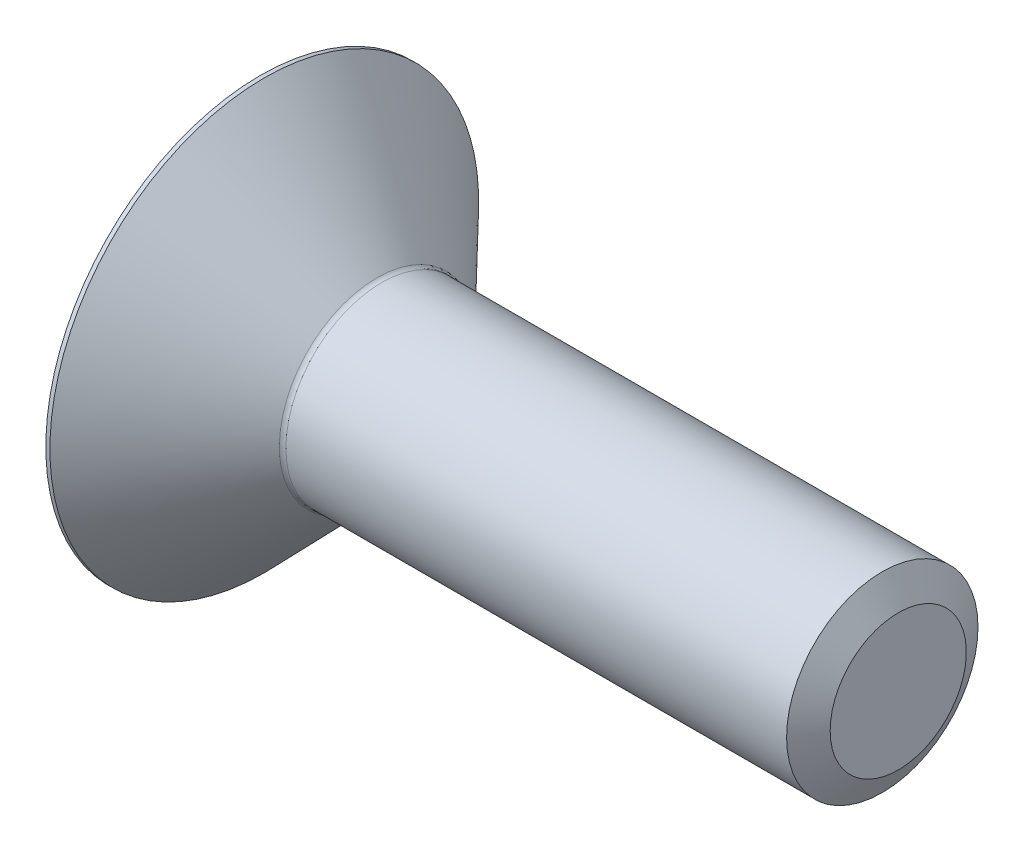
ISO-10303-21;
HEADER;
FILE_DESCRIPTION(('STEP AP214'),'2;1');
FILE_NAME('part.step','',(''),(''),'','','');
FILE_SCHEMA(('AUTOMOTIVE_DESIGN { 1 0 10303 214 1 1 1 1 }'));
ENDSEC;
DATA;
#1=APPLICATION_CONTEXT('core data for automotive mechanical design processes');
#2=APPLICATION_PROTOCOL_DEFINITION('international standard','automotive_design',2000,#1);
#3=PRODUCT_CONTEXT('',#1,'mechanical');
#4=PRODUCT('Part','Part','',(#3));
#5=PRODUCT_RELATED_PRODUCT_CATEGORY('part','',(#4));
#6=PRODUCT_DEFINITION_FORMATION('','',#4);
#7=PRODUCT_DEFINITION_CONTEXT('part definition',#1,'design');
#8=PRODUCT_DEFINITION('design','',#6,#7);
#9=PRODUCT_DEFINITION_SHAPE('','',#8);
#10=(LENGTH_UNIT() NAMED_UNIT(*) SI_UNIT(.MILLI.,.METRE.));
#11=(NAMED_UNIT(*) PLANE_ANGLE_UNIT() SI_UNIT($,.RADIAN.));
#12=(NAMED_UNIT(*) SI_UNIT($,.STERADIAN.) SOLID_ANGLE_UNIT());
#13=UNCERTAINTY_MEASURE_WITH_UNIT(LENGTH_MEASURE(1.E-05),#10,'distance_accuracy_value','');
#14=(GEOMETRIC_REPRESENTATION_CONTEXT(3) GLOBAL_UNCERTAINTY_ASSIGNED_CONTEXT((#13)) GLOBAL_UNIT_ASSIGNED_CONTEXT((#10,
#11,#12)) REPRESENTATION_CONTEXT('',''));
#15=CARTESIAN_POINT('',(0.,0.,0.));
#16=DIRECTION('',(0.,0.,1.));
#17=DIRECTION('',(1.,0.,0.));
#18=AXIS2_PLACEMENT_3D('',#15,#16,#17);
#19=CARTESIAN_POINT('',(0.,0.,0.));
#20=DIRECTION('',(1.,0.,0.));
#21=DIRECTION('',(0.,1.,0.));
#22=AXIS2_PLACEMENT_3D('',#19,#20,#21);
#23=CYLINDRICAL_SURFACE('',#22,1.5);
#24=CARTESIAN_POINT('',(-8.09755251837904,0.,0.));
#25=DIRECTION('',(1.,0.,0.));
#26=DIRECTION('',(0.,1.,0.));
#27=AXIS2_PLACEMENT_3D('',#24,#25,#26);
#28=CIRCLE('',#27,1.5);
#29=CARTESIAN_POINT('',(-8.09755251837904,1.5,0.));
#30=VERTEX_POINT('',#29);
#31=EDGE_CURVE('E133',#30,#30,#28,.T.);
#32=ORIENTED_EDGE('',*,*,#31,.T.);
#33=EDGE_LOOP('',(#32));
#34=FACE_BOUND('',#33,.T.);
#35=CARTESIAN_POINT('',(-0.25,0.,0.));
#36=DIRECTION('',(-1.,0.,0.));
#37=DIRECTION('',(0.,0.,1.));
#38=AXIS2_PLACEMENT_3D('',#35,#36,#37);
#39=CIRCLE('',#38,1.5);
#40=CARTESIAN_POINT('',(-0.25,0.,1.5));
#41=VERTEX_POINT('',#40);
#42=EDGE_CURVE('E321',#41,#41,#39,.T.);
#43=ORIENTED_EDGE('',*,*,#42,.T.);
#44=EDGE_LOOP('',(#43));
#45=FACE_BOUND('',#44,.T.);
#46=ADVANCED_FACE('F46',(#34,#45),#23,.T.);
#47=CARTESIAN_POINT('',(-10.,3.36,0.));
#48=DIRECTION('',(-1.,0.,0.));
#49=DIRECTION('',(0.,-1.,0.));
#50=AXIS2_PLACEMENT_3D('',#47,#48,#49);
#51=PLANE('',#50);
#52=CARTESIAN_POINT('',(-10.,0.,0.));
#53=DIRECTION('',(1.,0.,0.));
#54=DIRECTION('',(0.,1.,0.));
#55=AXIS2_PLACEMENT_3D('',#52,#53,#54);
#56=CIRCLE('',#55,3.36);
#57=CARTESIAN_POINT('',(-10.,3.36,0.));
#58=VERTEX_POINT('',#57);
#59=EDGE_CURVE('E224',#58,#58,#56,.T.);
#60=ORIENTED_EDGE('',*,*,#59,.F.);
#61=EDGE_LOOP('',(#60));
#62=FACE_BOUND('',#61,.T.);
#63=CARTESIAN_POINT('',(-10.,0.,0.));
#64=DIRECTION('',(-1.,0.,0.));
#65=DIRECTION('',(0.,-1.,0.));
#66=AXIS2_PLACEMENT_3D('',#63,#64,#65);
#67=CIRCLE('',#66,1.15470053837925);
#68=CARTESIAN_POINT('',(-10.,-0.57735026918963,0.999999999999998));
#69=VERTEX_POINT('',#68);
#70=CARTESIAN_POINT('',(-10.,-1.15470053837925,0.));
#71=VERTEX_POINT('',#70);
#72=EDGE_CURVE('E50',#69,#71,#67,.F.);
#73=ORIENTED_EDGE('',*,*,#72,.T.);
#74=CARTESIAN_POINT('',(-10.,-0.577350269189629,-0.999999999999999));
#75=VERTEX_POINT('',#74);
#76=EDGE_CURVE('E11',#71,#75,#67,.F.);
#77=ORIENTED_EDGE('',*,*,#76,.T.);
#78=CARTESIAN_POINT('',(-10.,0.577350269189627,-0.999999999999999));
#79=VERTEX_POINT('',#78);
#80=EDGE_CURVE('E55',#75,#79,#67,.F.);
#81=ORIENTED_EDGE('',*,*,#80,.T.);
#82=CARTESIAN_POINT('',(-10.,1.15470053837925,0.));
#83=VERTEX_POINT('',#82);
#84=EDGE_CURVE('E120',#79,#83,#67,.F.);
#85=ORIENTED_EDGE('',*,*,#84,.T.);
#86=CARTESIAN_POINT('',(-10.,0.,0.));
#87=DIRECTION('',(-1.,0.,0.));
#88=DIRECTION('',(0.,0.,1.));
#89=AXIS2_PLACEMENT_3D('',#86,#87,#88);
#90=CIRCLE('',#89,1.15470053837925);
#91=CARTESIAN_POINT('',(-10.,0.57735026918963,0.999999999999998));
#92=VERTEX_POINT('',#91);
#93=EDGE_CURVE('E105',#92,#83,#90,.T.);
#94=ORIENTED_EDGE('',*,*,#93,.F.);
#95=EDGE_CURVE('E114',#92,#69,#67,.F.);
#96=ORIENTED_EDGE('',*,*,#95,.T.);
#97=EDGE_LOOP('',(#73,#77,#81,#85,#94,#96));
#98=FACE_BOUND('',#97,.T.);
#99=ADVANCED_FACE('F121',(#62,#98),#51,.T.);
#100=CARTESIAN_POINT('',(0.,0.,0.));
#101=DIRECTION('',(1.,0.,0.));
#102=DIRECTION('',(0.,1.,0.));
#103=AXIS2_PLACEMENT_3D('',#100,#101,#102);
#104=CYLINDRICAL_SURFACE('',#103,3.36);
#105=ORIENTED_EDGE('',*,*,#59,.T.);
#106=EDGE_LOOP('',(#105));
#107=FACE_BOUND('',#106,.T.);
#108=CARTESIAN_POINT('',(-9.93618112114116,0.,0.));
#109=DIRECTION('',(1.,0.,0.));
#110=DIRECTION('',(0.,1.,0.));
#111=AXIS2_PLACEMENT_3D('',#108,#109,#110);
#112=CIRCLE('',#111,3.36);
#113=CARTESIAN_POINT('',(-9.93618112114116,3.36,0.));
#114=VERTEX_POINT('',#113);
#115=EDGE_CURVE('E226',#114,#114,#112,.T.);
#116=ORIENTED_EDGE('',*,*,#115,.F.);
#117=EDGE_LOOP('',(#116));
#118=FACE_BOUND('',#117,.T.);
#119=ADVANCED_FACE('F212',(#107,#118),#104,.T.);
#120=CARTESIAN_POINT('',(-8.1694864984129,0.,0.));
#121=DIRECTION('',(-1.,0.,0.));
#122=DIRECTION('',(0.,-1.,0.));
#123=AXIS2_PLACEMENT_3D('',#120,#121,#122);
#124=CONICAL_SURFACE('',#123,1.5305341629541,0.802851455917393);
#125=ORIENTED_EDGE('',*,*,#115,.T.);
#126=EDGE_LOOP('',(#125));
#127=FACE_BOUND('',#126,.T.);
#128=CARTESIAN_POINT('',(-8.1694864984129,0.,0.));
#129=DIRECTION('',(1.,0.,0.));
#130=DIRECTION('',(0.,1.,0.));
#131=AXIS2_PLACEMENT_3D('',#128,#129,#130);
#132=CIRCLE('',#131,1.5305341629541);
#133=CARTESIAN_POINT('',(-8.1694864984129,1.5305341629541,0.));
#134=VERTEX_POINT('',#133);
#135=EDGE_CURVE('E230',#134,#134,#132,.T.);
#136=ORIENTED_EDGE('',*,*,#135,.F.);
#137=EDGE_LOOP('',(#136));
#138=FACE_BOUND('',#137,.T.);
#139=ADVANCED_FACE('F208',(#127,#138),#124,.T.);
#140=CARTESIAN_POINT('',(-8.09755251837904,0.,0.));
#141=DIRECTION('',(1.,0.,0.));
#142=DIRECTION('',(0.,1.,0.));
#143=AXIS2_PLACEMENT_3D('',#140,#141,#142);
#144=TOROIDAL_SURFACE('',#143,1.6,0.0999999999999989);
#145=ORIENTED_EDGE('',*,*,#135,.T.);
#146=EDGE_LOOP('',(#145));
#147=FACE_BOUND('',#146,.T.);
#148=ORIENTED_EDGE('',*,*,#31,.F.);
#149=EDGE_LOOP('',(#148));
#150=FACE_BOUND('',#149,.T.);
#151=ADVANCED_FACE('F204',(#147,#150),#144,.F.);
#152=CARTESIAN_POINT('',(-9.7,0.,0.));
#153=DIRECTION('',(-1.,0.,0.));
#154=DIRECTION('',(0.,0.,1.));
#155=AXIS2_PLACEMENT_3D('',#152,#153,#154);
#156=CONICAL_SURFACE('',#155,0.,1.31660847419537);
#157=CARTESIAN_POINT('',(-10.0000300044996,-0.577234799135789,1.0002));
#158=CARTESIAN_POINT('',(-9.99379291920422,-0.6012250217386,0.958647715567044));
#159=CARTESIAN_POINT('',(-9.98813137861672,-0.625256195021441,0.917024502475671));
#160=CARTESIAN_POINT('',(-9.97818542172232,-0.67339838633044,0.833639781140784));
#161=CARTESIAN_POINT('',(-9.9739015302713,-0.697509431260084,0.791878226299064));
#162=CARTESIAN_POINT('',(-9.96695890316675,-0.745673772514856,0.708455140132714));
#163=CARTESIAN_POINT('',(-9.9642923745456,-0.769726780462718,0.666794108292159));
#164=CARTESIAN_POINT('',(-9.96071689299408,-0.81786166422335,0.583422044002323));
#165=CARTESIAN_POINT('',(-9.95980762113533,-0.841943534003895,0.541711022001162));
#166=CARTESIAN_POINT('',(-9.95980762113533,-0.890107273564984,0.458288977998839));
#167=CARTESIAN_POINT('',(-9.96071689299408,-0.914189143345529,0.416577955997677));
#168=CARTESIAN_POINT('',(-9.9642923745456,-0.962324027106161,0.333205891707841));
#169=CARTESIAN_POINT('',(-9.96695890316675,-0.986377035054023,0.291544859867286));
#170=CARTESIAN_POINT('',(-9.9739015302713,-1.03454137630879,0.208121773700936));
#171=CARTESIAN_POINT('',(-9.97818542172232,-1.05865242123844,0.166360218859216));
#172=CARTESIAN_POINT('',(-9.98813137861672,-1.10679461254744,0.0829754975243293));
#173=CARTESIAN_POINT('',(-9.99379291920422,-1.13082578583028,0.0413522844329566));
#174=CARTESIAN_POINT('',(-10.0000300044996,-1.15481600843309,-0.000199999999999398));
#175=B_SPLINE_CURVE_WITH_KNOTS('',3,(#157,#158,#159,#160,#161,#162,#163,#164,#165,#166,#167,
#168,#169,#170,#171,#172,#173,#174),.UNSPECIFIED.,.F.,.F.,(4,2,2,2,2,2,2,2,4),(0.,
0.145159524820137,0.290374287087485,0.434883682122849,0.57936684736763,0.723850012612411,
0.868359407647776,1.01357416991512,1.15873369473526),.UNSPECIFIED.);
#176=EDGE_CURVE('E139',#69,#71,#175,.T.);
#177=ORIENTED_EDGE('',*,*,#176,.T.);
#178=ORIENTED_EDGE('',*,*,#72,.F.);
#179=EDGE_LOOP('',(#177,#178));
#180=FACE_BOUND('',#179,.T.);
#181=ADVANCED_FACE('F207',(#180),#156,.F.);
#182=CARTESIAN_POINT('',(-10.1701338061757,-1.50813004503231,1.));
#183=CARTESIAN_POINT('',(-10.1603550434582,-1.46296169551439,1.));
#184=CARTESIAN_POINT('',(-10.1507010634319,-1.41776633015547,1.));
#185=CARTESIAN_POINT('',(-10.1317057249496,-1.32730802004726,1.));
#186=CARTESIAN_POINT('',(-10.1223643798043,-1.28204507250605,1.));
#187=CARTESIAN_POINT('',(-10.094887707109,-1.1460540932135,1.));
#188=CARTESIAN_POINT('',(-10.077318593487,-1.05520983554783,1.));
#189=CARTESIAN_POINT('',(-10.0446113120355,-0.873838301527072,1.));
#190=CARTESIAN_POINT('',(-10.0294545669183,-0.783314439111172,1.));
#191=CARTESIAN_POINT('',(-10.0026000869216,-0.60175454493786,1.));
#192=CARTESIAN_POINT('',(-9.99090169604684,-0.510718613654572,1.));
#193=CARTESIAN_POINT('',(-9.97246881045879,-0.32714728936339,1.));
#194=CARTESIAN_POINT('',(-9.96578776188203,-0.234606191530869,1.));
#195=CARTESIAN_POINT('',(-9.95903683627918,-0.0493046546038925,1.));
#196=CARTESIAN_POINT('',(-9.9589640024594,0.0434556678202325,1.));
#197=CARTESIAN_POINT('',(-9.96545349339635,0.229083736297407,1.));
#198=CARTESIAN_POINT('',(-9.97204147369278,0.32195051098941,1.));
#199=CARTESIAN_POINT('',(-9.99045721398657,0.50719254766132,1.));
#200=CARTESIAN_POINT('',(-10.0022884816115,0.599567438647765,1.));
#201=CARTESIAN_POINT('',(-10.0298118313046,0.785811374344474,1.));
#202=CARTESIAN_POINT('',(-10.0455836030667,0.879668210998825,1.));
#203=CARTESIAN_POINT('',(-10.0795232966728,1.06695285350417,1.));
#204=CARTESIAN_POINT('',(-10.0976915787193,1.16038059267178,1.));
#205=CARTESIAN_POINT('',(-10.1355853163011,1.34694314919725,1.));
#206=CARTESIAN_POINT('',(-10.1553112029702,1.44007787798179,1.));
#207=CARTESIAN_POINT('',(-10.1957971322914,1.62612272763755,1.));
#208=CARTESIAN_POINT('',(-10.216557196056,1.71903284388273,1.));
#209=CARTESIAN_POINT('',(-10.2585485742601,1.90363742744431,1.));
#210=CARTESIAN_POINT('',(-10.2797718689088,1.99533372655925,1.));
#211=CARTESIAN_POINT('',(-10.3227143057913,2.17861191601367,1.));
#212=CARTESIAN_POINT('',(-10.3444334585808,2.27019380387373,1.));
#213=CARTESIAN_POINT('',(-10.3882042420233,2.45314970796374,1.));
#214=CARTESIAN_POINT('',(-10.4102553943374,2.54452383886909,1.));
#215=CARTESIAN_POINT('',(-10.4546332471854,2.72720190599484,1.));
#216=CARTESIAN_POINT('',(-10.4769599382911,2.81850584450411,1.));
#217=CARTESIAN_POINT('',(-10.4993826695211,2.90978592143881,1.));
#218=B_SPLINE_CURVE_WITH_KNOTS('',3,(#182,#183,#184,#185,#186,#187,#188,#189,#190,#191,#192,
#193,#194,#195,#196,#197,#198,#199,#200,#201,#202,#203,#204,#205,#206,#207,#208,#209,#210,#211,
#212,#213,#214,#215,#216,#217),.UNSPECIFIED.,.F.,.F.,(4,2,2,2,2,2,2,2,2,2,2,2,2,2,2,2,2,4),(0.,
0.138643869889783,0.277293635233154,0.554857004517544,0.830167022781708,1.10542478551795,
1.38357462934898,1.66160001660696,1.94070037269332,2.2199877224158,2.50545939030146,
2.7909740144124,3.07656794584653,3.36216771000262,3.64452690710853,3.92689212062336,
4.20888343548739,4.49086512790399),.UNSPECIFIED.);
#219=EDGE_CURVE('E110',#92,#69,#218,.F.);
#220=ORIENTED_EDGE('',*,*,#219,.T.);
#221=ORIENTED_EDGE('',*,*,#95,.F.);
#222=EDGE_LOOP('',(#220,#221));
#223=FACE_BOUND('',#222,.T.);
#224=ADVANCED_FACE('F115',(#223),#156,.F.);
#225=CARTESIAN_POINT('',(-10.0000300044996,1.15481600843309,-0.000199999999999895));
#226=CARTESIAN_POINT('',(-9.99379291920422,1.13082578583028,0.0413522844329562));
#227=CARTESIAN_POINT('',(-9.98813137861672,1.10679461254744,0.0829754975243289));
#228=CARTESIAN_POINT('',(-9.97818542172232,1.05865242123844,0.166360218859216));
#229=CARTESIAN_POINT('',(-9.9739015302713,1.03454137630879,0.208121773700936));
#230=CARTESIAN_POINT('',(-9.96695890316675,0.986377035054023,0.291544859867286));
#231=CARTESIAN_POINT('',(-9.9642923745456,0.962324027106161,0.333205891707841));
#232=CARTESIAN_POINT('',(-9.96071689299408,0.914189143345529,0.416577955997677));
#233=CARTESIAN_POINT('',(-9.95980762113533,0.890107273564984,0.458288977998839));
#234=CARTESIAN_POINT('',(-9.95980762113533,0.841943534003895,0.541711022001161));
#235=CARTESIAN_POINT('',(-9.96071689299408,0.81786166422335,0.583422044002323));
#236=CARTESIAN_POINT('',(-9.9642923745456,0.769726780462718,0.666794108292159));
#237=CARTESIAN_POINT('',(-9.96695890316675,0.745673772514856,0.708455140132714));
#238=CARTESIAN_POINT('',(-9.9739015302713,0.697509431260084,0.791878226299064));
#239=CARTESIAN_POINT('',(-9.97818542172232,0.67339838633044,0.833639781140784));
#240=CARTESIAN_POINT('',(-9.98813137861672,0.625256195021441,0.917024502475671));
#241=CARTESIAN_POINT('',(-9.99379291920422,0.6012250217386,0.958647715567044));
#242=CARTESIAN_POINT('',(-10.0000300044996,0.577234799135789,1.0002));
#243=B_SPLINE_CURVE_WITH_KNOTS('',3,(#225,#226,#227,#228,#229,#230,#231,#232,#233,#234,#235,
#236,#237,#238,#239,#240,#241,#242),.UNSPECIFIED.,.F.,.F.,(4,2,2,2,2,2,2,2,4),(0.,
0.145159524820137,0.290374287087485,0.434883682122849,0.57936684736763,0.723850012612411,
0.868359407647776,1.01357416991512,1.15873369473526),.UNSPECIFIED.);
#244=EDGE_CURVE('E101',#83,#92,#243,.T.);
#245=ORIENTED_EDGE('',*,*,#244,.T.);
#246=ORIENTED_EDGE('',*,*,#93,.T.);
#247=EDGE_LOOP('',(#245,#246));
#248=FACE_BOUND('',#247,.T.);
#249=ADVANCED_FACE('F103',(#248),#156,.F.);
#250=CARTESIAN_POINT('',(-10.0000300044996,0.577234799135789,-1.0002));
#251=CARTESIAN_POINT('',(-9.99379291920422,0.6012250217386,-0.958647715567043));
#252=CARTESIAN_POINT('',(-9.98813137861672,0.625256195021441,-0.91702450247567));
#253=CARTESIAN_POINT('',(-9.97818542172232,0.67339838633044,-0.833639781140783));
#254=CARTESIAN_POINT('',(-9.9739015302713,0.697509431260084,-0.791878226299063));
#255=CARTESIAN_POINT('',(-9.96695890316675,0.745673772514856,-0.708455140132713));
#256=CARTESIAN_POINT('',(-9.9642923745456,0.769726780462718,-0.666794108292159));
#257=CARTESIAN_POINT('',(-9.96071689299408,0.817861664223349,-0.583422044002322));
#258=CARTESIAN_POINT('',(-9.95980762113533,0.841943534003894,-0.541711022001161));
#259=CARTESIAN_POINT('',(-9.95980762113533,0.890107273564984,-0.458288977998838));
#260=CARTESIAN_POINT('',(-9.96071689299408,0.914189143345529,-0.416577955997677));
#261=CARTESIAN_POINT('',(-9.9642923745456,0.962324027106161,-0.33320589170784));
#262=CARTESIAN_POINT('',(-9.96695890316675,0.986377035054023,-0.291544859867286));
#263=CARTESIAN_POINT('',(-9.9739015302713,1.03454137630879,-0.208121773700936));
#264=CARTESIAN_POINT('',(-9.97818542172232,1.05865242123844,-0.166360218859216));
#265=CARTESIAN_POINT('',(-9.98813137861672,1.10679461254744,-0.0829754975243288));
#266=CARTESIAN_POINT('',(-9.99379291920422,1.13082578583028,-0.0413522844329561));
#267=CARTESIAN_POINT('',(-10.0000300044996,1.15481600843309,0.000199999999999868));
#268=B_SPLINE_CURVE_WITH_KNOTS('',3,(#250,#251,#252,#253,#254,#255,#256,#257,#258,#259,#260,
#261,#262,#263,#264,#265,#266,#267),.UNSPECIFIED.,.F.,.F.,(4,2,2,2,2,2,2,2,4),(0.,
0.145159524820137,0.290374287087485,0.434883682122849,0.57936684736763,0.723850012612411,
0.868359407647776,1.01357416991512,1.15873369473526),.UNSPECIFIED.);
#269=EDGE_CURVE('E123',#79,#83,#268,.T.);
#270=ORIENTED_EDGE('',*,*,#269,.T.);
#271=ORIENTED_EDGE('',*,*,#84,.F.);
#272=EDGE_LOOP('',(#270,#271));
#273=FACE_BOUND('',#272,.T.);
#274=ADVANCED_FACE('F304',(#273),#156,.F.);
#275=CARTESIAN_POINT('',(-10.1701338061757,-1.50813004503231,-0.999999999999999));
#276=CARTESIAN_POINT('',(-10.1603550434582,-1.46296169551439,-0.999999999999999));
#277=CARTESIAN_POINT('',(-10.1507010634319,-1.41776633015547,-0.999999999999999));
#278=CARTESIAN_POINT('',(-10.1317057249496,-1.32730802004726,-0.999999999999999));
#279=CARTESIAN_POINT('',(-10.1223643798043,-1.28204507250605,-0.999999999999999));
#280=CARTESIAN_POINT('',(-10.094887707109,-1.1460540932135,-0.999999999999999));
#281=CARTESIAN_POINT('',(-10.077318593487,-1.05520983554783,-0.999999999999999));
#282=CARTESIAN_POINT('',(-10.0446113120355,-0.873838301527072,-0.999999999999999));
#283=CARTESIAN_POINT('',(-10.0294545669183,-0.783314439111172,-0.999999999999999));
#284=CARTESIAN_POINT('',(-10.0026000869216,-0.60175454493786,-0.999999999999999));
#285=CARTESIAN_POINT('',(-9.99090169604684,-0.510718613654572,-0.999999999999999));
#286=CARTESIAN_POINT('',(-9.97246881045879,-0.32714728936339,-0.999999999999999));
#287=CARTESIAN_POINT('',(-9.96578776188203,-0.234606191530869,-0.999999999999999));
#288=CARTESIAN_POINT('',(-9.95903683627918,-0.0493046546038928,-0.999999999999999));
#289=CARTESIAN_POINT('',(-9.9589640024594,0.0434556678202321,-0.999999999999999));
#290=CARTESIAN_POINT('',(-9.96545349339635,0.229083736297406,-0.999999999999999));
#291=CARTESIAN_POINT('',(-9.97204147369279,0.32195051098941,-0.999999999999999));
#292=CARTESIAN_POINT('',(-9.99045721398657,0.50719254766132,-0.999999999999999));
#293=CARTESIAN_POINT('',(-10.0022884816115,0.599567438647765,-0.999999999999999));
#294=CARTESIAN_POINT('',(-10.0298118313046,0.785811374344474,-0.999999999999999));
#295=CARTESIAN_POINT('',(-10.0455836030667,0.879668210998825,-0.999999999999999));
#296=CARTESIAN_POINT('',(-10.0795232966728,1.06695285350417,-0.999999999999999));
#297=CARTESIAN_POINT('',(-10.0976915787193,1.16038059267178,-0.999999999999999));
#298=CARTESIAN_POINT('',(-10.1355853163011,1.34694314919725,-0.999999999999999));
#299=CARTESIAN_POINT('',(-10.1553112029702,1.44007787798179,-0.999999999999999));
#300=CARTESIAN_POINT('',(-10.1957971322914,1.62612272763755,-0.999999999999999));
#301=CARTESIAN_POINT('',(-10.216557196056,1.71903284388273,-0.999999999999999));
#302=CARTESIAN_POINT('',(-10.2585485742601,1.90363742744432,-0.999999999999999));
#303=CARTESIAN_POINT('',(-10.2797718689088,1.99533372655926,-0.999999999999999));
#304=CARTESIAN_POINT('',(-10.3227143057913,2.17861191601367,-0.999999999999999));
#305=CARTESIAN_POINT('',(-10.3444334585808,2.27019380387373,-0.999999999999999));
#306=CARTESIAN_POINT('',(-10.3882042420233,2.45314970796374,-0.999999999999999));
#307=CARTESIAN_POINT('',(-10.4102553943374,2.54452383886909,-0.999999999999999));
#308=CARTESIAN_POINT('',(-10.4546332471854,2.72720190599484,-0.999999999999999));
#309=CARTESIAN_POINT('',(-10.4769599382911,2.81850584450411,-0.999999999999999));
#310=CARTESIAN_POINT('',(-10.4993826695211,2.90978592143881,-0.999999999999999));
#311=B_SPLINE_CURVE_WITH_KNOTS('',3,(#275,#276,#277,#278,#279,#280,#281,#282,#283,#284,#285,
#286,#287,#288,#289,#290,#291,#292,#293,#294,#295,#296,#297,#298,#299,#300,#301,#302,#303,#304,
#305,#306,#307,#308,#309,#310),.UNSPECIFIED.,.F.,.F.,(4,2,2,2,2,2,2,2,2,2,2,2,2,2,2,2,2,4),(0.,
0.138643869889783,0.277293635233154,0.554857004517545,0.830167022781709,1.10542478551795,
1.38357462934898,1.66160001660696,1.94070037269332,2.2199877224158,2.50545939030146,
2.7909740144124,3.07656794584653,3.36216771000262,3.64452690710853,3.92689212062336,
4.20888343548739,4.49086512790399),.UNSPECIFIED.);
#312=EDGE_CURVE('E260',#75,#79,#311,.T.);
#313=ORIENTED_EDGE('',*,*,#312,.T.);
#314=ORIENTED_EDGE('',*,*,#80,.F.);
#315=EDGE_LOOP('',(#313,#314));
#316=FACE_BOUND('',#315,.T.);
#317=ADVANCED_FACE('F292',(#316),#156,.F.);
#318=CARTESIAN_POINT('',(-10.0000300044996,-1.15481600843309,0.000200000000000662));
#319=CARTESIAN_POINT('',(-9.99379291920422,-1.13082578583028,-0.0413522844329554));
#320=CARTESIAN_POINT('',(-9.98813137861672,-1.10679461254744,-0.0829754975243281));
#321=CARTESIAN_POINT('',(-9.97818542172232,-1.05865242123844,-0.166360218859215));
#322=CARTESIAN_POINT('',(-9.9739015302713,-1.03454137630879,-0.208121773700935));
#323=CARTESIAN_POINT('',(-9.96695890316675,-0.986377035054023,-0.291544859867285));
#324=CARTESIAN_POINT('',(-9.9642923745456,-0.962324027106161,-0.33320589170784));
#325=CARTESIAN_POINT('',(-9.96071689299408,-0.914189143345529,-0.416577955997676));
#326=CARTESIAN_POINT('',(-9.95980762113533,-0.890107273564985,-0.458288977998838));
#327=CARTESIAN_POINT('',(-9.95980762113533,-0.841943534003895,-0.54171102200116));
#328=CARTESIAN_POINT('',(-9.96071689299408,-0.81786166422335,-0.583422044002322));
#329=CARTESIAN_POINT('',(-9.9642923745456,-0.769726780462718,-0.666794108292158));
#330=CARTESIAN_POINT('',(-9.96695890316675,-0.745673772514856,-0.708455140132713));
#331=CARTESIAN_POINT('',(-9.9739015302713,-0.697509431260085,-0.791878226299063));
#332=CARTESIAN_POINT('',(-9.97818542172232,-0.67339838633044,-0.833639781140783));
#333=CARTESIAN_POINT('',(-9.98813137861672,-0.625256195021442,-0.91702450247567));
#334=CARTESIAN_POINT('',(-9.99379291920422,-0.601225021738601,-0.958647715567043));
#335=CARTESIAN_POINT('',(-10.0000300044996,-0.577234799135789,-1.0002));
#336=B_SPLINE_CURVE_WITH_KNOTS('',3,(#318,#319,#320,#321,#322,#323,#324,#325,#326,#327,#328,
#329,#330,#331,#332,#333,#334,#335),.UNSPECIFIED.,.F.,.F.,(4,2,2,2,2,2,2,2,4),(0.,
0.145159524820137,0.290374287087484,0.434883682122849,0.57936684736763,0.723850012612411,
0.868359407647776,1.01357416991512,1.15873369473526),.UNSPECIFIED.);
#337=EDGE_CURVE('E141',#71,#75,#336,.T.);
#338=ORIENTED_EDGE('',*,*,#337,.T.);
#339=ORIENTED_EDGE('',*,*,#76,.F.);
#340=EDGE_LOOP('',(#338,#339));
#341=FACE_BOUND('',#340,.T.);
#342=ADVANCED_FACE('F294',(#341),#156,.F.);
#343=CARTESIAN_POINT('',(-8.9,0.,0.));
#344=DIRECTION('',(-1.,0.,0.));
#345=DIRECTION('',(0.,0.,1.));
#346=AXIS2_PLACEMENT_3D('',#343,#344,#345);
#347=CONICAL_SURFACE('',#346,1.15470053837925,1.0471975511966);
#348=CARTESIAN_POINT('',(-8.23333333333334,0.,0.));
#349=VERTEX_POINT('',#348);
#350=VERTEX_LOOP('',#349);
#351=FACE_BOUND('',#350,.T.);
#352=CARTESIAN_POINT('',(-9.27183528873947,-1.49514512143374,1.));
#353=CARTESIAN_POINT('',(-9.25111502079343,-1.4519612611533,1.));
#354=CARTESIAN_POINT('',(-9.23061367234947,-1.40867282404236,1.));
#355=CARTESIAN_POINT('',(-9.1901634335246,-1.32182947914248,1.));
#356=CARTESIAN_POINT('',(-9.17021464256729,-1.27827452509756,1.));
#357=CARTESIAN_POINT('',(-9.11114515483649,-1.14662339890625,1.));
#358=CARTESIAN_POINT('',(-9.07305252653304,-1.05805724149108,1.));
#359=CARTESIAN_POINT('',(-9.00024582070058,-0.876833003172497,1.));
#360=CARTESIAN_POINT('',(-8.96564584045392,-0.784128452056496,1.));
#361=CARTESIAN_POINT('',(-8.90407347381845,-0.596331746532131,1.));
#362=CARTESIAN_POINT('',(-8.87708128484786,-0.501246505541257,1.));
#363=CARTESIAN_POINT('',(-8.84577577003502,-0.356699986452703,1.));
#364=CARTESIAN_POINT('',(-8.83687509854699,-0.308244163171709,1.));
#365=CARTESIAN_POINT('',(-8.82274243175691,-0.210788870695443,1.));
#366=CARTESIAN_POINT('',(-8.81751018853518,-0.161789438465742,1.));
#367=CARTESIAN_POINT('',(-8.81119898098177,-0.0641060489970662,1.));
#368=CARTESIAN_POINT('',(-8.81007100501111,-0.0154253461269771,1.));
#369=CARTESIAN_POINT('',(-8.81193297830514,0.0818553564032753,1.));
#370=CARTESIAN_POINT('',(-8.81492318255361,0.130455350879702,1.));
#371=CARTESIAN_POINT('',(-8.8271183217293,0.250369589613778,1.));
#372=CARTESIAN_POINT('',(-8.83860856098489,0.321451919115027,1.));
#373=CARTESIAN_POINT('',(-8.86824031739763,0.462229038490168,1.));
#374=CARTESIAN_POINT('',(-8.88638985094493,0.531922048861733,1.));
#375=CARTESIAN_POINT('',(-8.92786972268665,0.671415729806806,1.));
#376=CARTESIAN_POINT('',(-8.95130716830693,0.741183729418071,1.));
#377=CARTESIAN_POINT('',(-9.00156448824641,0.879438319396289,1.));
#378=CARTESIAN_POINT('',(-9.02838317523047,0.947925349932561,1.));
#379=CARTESIAN_POINT('',(-9.1000539154734,1.12214515906645,1.));
#380=CARTESIAN_POINT('',(-9.14657230519899,1.22718574040678,1.));
#381=CARTESIAN_POINT('',(-9.24287692224798,1.43575968104558,1.));
#382=CARTESIAN_POINT('',(-9.29266398782224,1.53929264533348,1.));
#383=CARTESIAN_POINT('',(-9.39433644453464,1.74546702338822,1.));
#384=CARTESIAN_POINT('',(-9.44622418186697,1.84810727553999,1.));
#385=CARTESIAN_POINT('',(-9.55133836883522,2.05270058021726,1.));
#386=CARTESIAN_POINT('',(-9.60456486267233,2.15465360991173,1.));
#387=CARTESIAN_POINT('',(-9.7068669169112,2.34846553091283,1.));
#388=CARTESIAN_POINT('',(-9.75585965896404,2.44036823161571,1.));
#389=CARTESIAN_POINT('',(-9.85440313282821,2.62387799005301,1.));
#390=CARTESIAN_POINT('',(-9.90395388528949,2.71548503668387,1.));
#391=CARTESIAN_POINT('',(-10.0033471076798,2.89823865557593,1.));
#392=CARTESIAN_POINT('',(-10.053188515041,2.98938580641155,1.));
#393=CARTESIAN_POINT('',(-10.1531957233761,3.17149583112622,1.));
#394=CARTESIAN_POINT('',(-10.2033615072371,3.26245871439935,1.));
#395=CARTESIAN_POINT('',(-10.253646212205,3.35335539208176,1.));
#396=B_SPLINE_CURVE_WITH_KNOTS('',3,(#352,#353,#354,#355,#356,#357,#358,#359,#360,#361,#362,
#363,#364,#365,#366,#367,#368,#369,#370,#371,#372,#373,#374,#375,#376,#377,#378,#379,#380,#381,
#382,#383,#384,#385,#386,#387,#388,#389,#390,#391,#392,#393,#394,#395),.UNSPECIFIED.,.F.,.F.,(4,
2,2,2,2,2,2,2,2,2,2,2,2,2,2,2,2,2,2,2,2,4),(0.,0.14369034182065,0.287406372566272,
0.57656033287749,0.873259488934029,1.16917907000006,1.31686338831957,1.46453772487642,
1.61044269221658,1.75635669390451,1.97192533331897,2.18775432802313,2.40842600301165,
2.62902040304935,2.97355048126458,3.31816926186283,3.66318417395131,4.00821049225242,
4.32064609598596,4.63309330006988,4.94474578248761,5.25638195528641),.UNSPECIFIED.);
#397=CARTESIAN_POINT('',(-8.9,-0.577350269189627,1.));
#398=VERTEX_POINT('',#397);
#399=CARTESIAN_POINT('',(-8.9,0.577350269189627,1.));
#400=VERTEX_POINT('',#399);
#401=EDGE_CURVE('E173',#398,#400,#396,.T.);
#402=ORIENTED_EDGE('',*,*,#401,.T.);
#403=CARTESIAN_POINT('',(-8.90006667666567,0.577234799135789,1.0002));
#404=CARTESIAN_POINT('',(-8.88540897364915,0.602607795820548,0.95625268060172));
#405=CARTESIAN_POINT('',(-8.8720777236209,0.628199807531658,0.91192601605018));
#406=CARTESIAN_POINT('',(-8.84880650762346,0.679827098330832,0.822504925328878));
#407=CARTESIAN_POINT('',(-8.83887477654979,0.705863295614159,0.777408908798269));
#408=CARTESIAN_POINT('',(-8.82341269488208,0.757612978088368,0.687775829477381));
#409=CARTESIAN_POINT('',(-8.81777946809896,0.783318495222184,0.643252567766781));
#410=CARTESIAN_POINT('',(-8.81105128864026,0.834850648373672,0.553996260284983));
#411=CARTESIAN_POINT('',(-8.80995076792167,0.860677096749782,0.509263539518505));
#412=CARTESIAN_POINT('',(-8.81222505229814,0.90894626412669,0.425658889182653));
#413=CARTESIAN_POINT('',(-8.81504143886341,0.931396163287558,0.386774523211234));
#414=CARTESIAN_POINT('',(-8.82397245021735,0.976149681982094,0.309259155014814));
#415=CARTESIAN_POINT('',(-8.8300901337543,0.998453146411451,0.270628421438361));
#416=CARTESIAN_POINT('',(-8.84538572572582,1.04329913914046,0.192952883515855));
#417=CARTESIAN_POINT('',(-8.85462855216896,1.0658359836813,0.153917923728832));
#418=CARTESIAN_POINT('',(-8.87560684575553,1.11057330008463,0.0764306187239879));
#419=CARTESIAN_POINT('',(-8.88733737513366,1.13277434629517,0.0379772787061408));
#420=CARTESIAN_POINT('',(-8.90006667666567,1.15481600843309,-0.000200000000000042));
#421=B_SPLINE_CURVE_WITH_KNOTS('',3,(#403,#404,#405,#406,#407,#408,#409,#410,#411,#412,#413,
#414,#415,#416,#417,#418,#419,#420),.UNSPECIFIED.,.F.,.F.,(4,2,2,2,2,2,2,2,4),(0.,
0.158523820030115,0.317428970089342,0.472400167924633,0.627180939971648,0.76201658487271,
0.896977373984232,1.03493410168667,1.17261952416172),.UNSPECIFIED.);
#422=CARTESIAN_POINT('',(-8.9,1.15470053837925,0.));
#423=VERTEX_POINT('',#422);
#424=EDGE_CURVE('E130',#400,#423,#421,.T.);
#425=ORIENTED_EDGE('',*,*,#424,.T.);
#426=CARTESIAN_POINT('',(-8.90006667666567,1.15481600843309,0.000200000000000105));
#427=CARTESIAN_POINT('',(-8.88540897364915,1.12944301174833,-0.0437473193982797));
#428=CARTESIAN_POINT('',(-8.8720777236209,1.10385100003722,-0.0880739839498199));
#429=CARTESIAN_POINT('',(-8.84880650762346,1.05222370923805,-0.177495074671122));
#430=CARTESIAN_POINT('',(-8.83887477654979,1.02618751195472,-0.222591091201731));
#431=CARTESIAN_POINT('',(-8.82341269488208,0.97443782948051,-0.312224170522618));
#432=CARTESIAN_POINT('',(-8.81777946809896,0.948732312346695,-0.356747432233219));
#433=CARTESIAN_POINT('',(-8.81105128864026,0.897200159195207,-0.446003739715017));
#434=CARTESIAN_POINT('',(-8.80995076792167,0.871373710819097,-0.490736460481494));
#435=CARTESIAN_POINT('',(-8.81222505229814,0.823104543442189,-0.574341110817346));
#436=CARTESIAN_POINT('',(-8.81504143886341,0.800654644281321,-0.613225476788766));
#437=CARTESIAN_POINT('',(-8.82397245021735,0.755901125586785,-0.690740844985186));
#438=CARTESIAN_POINT('',(-8.8300901337543,0.733597661157428,-0.729371578561639));
#439=CARTESIAN_POINT('',(-8.84538572572582,0.68875166842842,-0.807047116484144));
#440=CARTESIAN_POINT('',(-8.85462855216896,0.666214823887576,-0.846082076271167));
#441=CARTESIAN_POINT('',(-8.87560684575553,0.621477507484251,-0.923569381276011));
#442=CARTESIAN_POINT('',(-8.88733737513366,0.599276461273707,-0.962022721293858));
#443=CARTESIAN_POINT('',(-8.90006667666567,0.577234799135789,-1.0002));
#444=B_SPLINE_CURVE_WITH_KNOTS('',3,(#426,#427,#428,#429,#430,#431,#432,#433,#434,#435,#436,
#437,#438,#439,#440,#441,#442,#443),.UNSPECIFIED.,.F.,.F.,(4,2,2,2,2,2,2,2,4),(0.,
0.158523820030115,0.317428970089342,0.472400167924633,0.627180939971648,0.76201658487271,
0.896977373984232,1.03493410168667,1.17261952416172),.UNSPECIFIED.);
#445=CARTESIAN_POINT('',(-8.9,0.577350269189626,-1.));
#446=VERTEX_POINT('',#445);
#447=EDGE_CURVE('E225',#423,#446,#444,.T.);
#448=ORIENTED_EDGE('',*,*,#447,.T.);
#449=CARTESIAN_POINT('',(-9.27183528873947,-1.49514512143374,-0.999999999999999));
#450=CARTESIAN_POINT('',(-9.25111502079343,-1.4519612611533,-0.999999999999999));
#451=CARTESIAN_POINT('',(-9.23061367234947,-1.40867282404236,-0.999999999999999));
#452=CARTESIAN_POINT('',(-9.1901634335246,-1.32182947914248,-0.999999999999999));
#453=CARTESIAN_POINT('',(-9.17021464256729,-1.27827452509756,-0.999999999999999));
#454=CARTESIAN_POINT('',(-9.11114515483649,-1.14662339890625,-0.999999999999999));
#455=CARTESIAN_POINT('',(-9.07305252653304,-1.05805724149108,-0.999999999999999));
#456=CARTESIAN_POINT('',(-9.00024582070058,-0.876833003172497,-0.999999999999999));
#457=CARTESIAN_POINT('',(-8.96564584045392,-0.784128452056496,-0.999999999999999));
#458=CARTESIAN_POINT('',(-8.90407347381845,-0.596331746532131,-0.999999999999999));
#459=CARTESIAN_POINT('',(-8.87708128484786,-0.501246505541257,-0.999999999999999));
#460=CARTESIAN_POINT('',(-8.84577577003502,-0.356699986452703,-0.999999999999999));
#461=CARTESIAN_POINT('',(-8.83687509854699,-0.308244163171709,-0.999999999999999));
#462=CARTESIAN_POINT('',(-8.82274243175691,-0.210788870695443,-0.999999999999999));
#463=CARTESIAN_POINT('',(-8.81751018853518,-0.161789438465743,-0.999999999999999));
#464=CARTESIAN_POINT('',(-8.81119898098177,-0.0641060489970667,-0.999999999999999));
#465=CARTESIAN_POINT('',(-8.81007100501111,-0.0154253461269776,-0.999999999999999));
#466=CARTESIAN_POINT('',(-8.81193297830514,0.0818553564032748,-0.999999999999999));
#467=CARTESIAN_POINT('',(-8.81492318255361,0.130455350879701,-0.999999999999999));
#468=CARTESIAN_POINT('',(-8.8271183217293,0.250369589613778,-0.999999999999999));
#469=CARTESIAN_POINT('',(-8.83860856098489,0.321451919115027,-0.999999999999999));
#470=CARTESIAN_POINT('',(-8.86824031739763,0.462229038490167,-0.999999999999999));
#471=CARTESIAN_POINT('',(-8.88638985094493,0.531922048861732,-0.999999999999999));
#472=CARTESIAN_POINT('',(-8.92786972268665,0.671415729806805,-0.999999999999999));
#473=CARTESIAN_POINT('',(-8.95130716830693,0.74118372941807,-0.999999999999999));
#474=CARTESIAN_POINT('',(-9.00156448824641,0.879438319396288,-0.999999999999999));
#475=CARTESIAN_POINT('',(-9.02838317523047,0.94792534993256,-0.999999999999999));
#476=CARTESIAN_POINT('',(-9.1000539154734,1.12214515906644,-0.999999999999999));
#477=CARTESIAN_POINT('',(-9.14657230519899,1.22718574040678,-0.999999999999999));
#478=CARTESIAN_POINT('',(-9.24287692224798,1.43575968104558,-0.999999999999999));
#479=CARTESIAN_POINT('',(-9.29266398782224,1.53929264533348,-0.999999999999999));
#480=CARTESIAN_POINT('',(-9.39433644453464,1.74546702338822,-0.999999999999999));
#481=CARTESIAN_POINT('',(-9.44622418186697,1.84810727553999,-0.999999999999999));
#482=CARTESIAN_POINT('',(-9.55133836883522,2.05270058021726,-0.999999999999999));
#483=CARTESIAN_POINT('',(-9.60456486267233,2.15465360991173,-0.999999999999999));
#484=CARTESIAN_POINT('',(-9.7068669169112,2.34846553091283,-0.999999999999999));
#485=CARTESIAN_POINT('',(-9.75585965896404,2.44036823161571,-0.999999999999999));
#486=CARTESIAN_POINT('',(-9.85440313282821,2.623877990053,-0.999999999999999));
#487=CARTESIAN_POINT('',(-9.90395388528948,2.71548503668387,-0.999999999999999));
#488=CARTESIAN_POINT('',(-10.0033471076798,2.89823865557593,-0.999999999999999));
#489=CARTESIAN_POINT('',(-10.053188515041,2.98938580641155,-0.999999999999999));
#490=CARTESIAN_POINT('',(-10.1531957233761,3.17149583112622,-0.999999999999999));
#491=CARTESIAN_POINT('',(-10.2033615072371,3.26245871439935,-0.999999999999999));
#492=CARTESIAN_POINT('',(-10.253646212205,3.35335539208176,-0.999999999999999));
#493=B_SPLINE_CURVE_WITH_KNOTS('',3,(#449,#450,#451,#452,#453,#454,#455,#456,#457,#458,#459,
#460,#461,#462,#463,#464,#465,#466,#467,#468,#469,#470,#471,#472,#473,#474,#475,#476,#477,#478,
#479,#480,#481,#482,#483,#484,#485,#486,#487,#488,#489,#490,#491,#492),.UNSPECIFIED.,.F.,.F.,(4,
2,2,2,2,2,2,2,2,2,2,2,2,2,2,2,2,2,2,2,2,4),(0.,0.143690341820651,0.287406372566273,
0.576560332877491,0.873259488934031,1.16917907000006,1.31686338831957,1.46453772487642,
1.61044269221659,1.75635669390452,1.97192533331898,2.18775432802313,2.40842600301165,
2.62902040304935,2.97355048126458,3.31816926186283,3.66318417395131,4.00821049225242,
4.32064609598597,4.63309330006988,4.94474578248761,5.25638195528641),.UNSPECIFIED.);
#494=CARTESIAN_POINT('',(-8.9,-0.577350269189627,-0.999999999999999));
#495=VERTEX_POINT('',#494);
#496=EDGE_CURVE('E109',#446,#495,#493,.F.);
#497=ORIENTED_EDGE('',*,*,#496,.T.);
#498=CARTESIAN_POINT('',(-8.90006667666567,-0.577234799135789,-1.0002));
#499=CARTESIAN_POINT('',(-8.88540897364915,-0.602607795820548,-0.956252680601719));
#500=CARTESIAN_POINT('',(-8.8720777236209,-0.628199807531658,-0.911926016050179));
#501=CARTESIAN_POINT('',(-8.84880650762346,-0.679827098330832,-0.822504925328877));
#502=CARTESIAN_POINT('',(-8.83887477654979,-0.705863295614159,-0.777408908798268));
#503=CARTESIAN_POINT('',(-8.82341269488208,-0.757612978088368,-0.68777582947738));
#504=CARTESIAN_POINT('',(-8.81777946809896,-0.783318495222184,-0.64325256776678));
#505=CARTESIAN_POINT('',(-8.81105128864026,-0.834850648373672,-0.553996260284982));
#506=CARTESIAN_POINT('',(-8.80995076792167,-0.860677096749782,-0.509263539518504));
#507=CARTESIAN_POINT('',(-8.81222505229814,-0.90894626412669,-0.425658889182652));
#508=CARTESIAN_POINT('',(-8.81504143886341,-0.931396163287558,-0.386774523211233));
#509=CARTESIAN_POINT('',(-8.82397245021735,-0.976149681982094,-0.309259155014813));
#510=CARTESIAN_POINT('',(-8.8300901337543,-0.998453146411451,-0.27062842143836));
#511=CARTESIAN_POINT('',(-8.84538572572582,-1.04329913914046,-0.192952883515854));
#512=CARTESIAN_POINT('',(-8.85462855216896,-1.0658359836813,-0.153917923728831));
#513=CARTESIAN_POINT('',(-8.87560684575553,-1.11057330008463,-0.0764306187239868));
#514=CARTESIAN_POINT('',(-8.88733737513366,-1.13277434629517,-0.0379772787061398));
#515=CARTESIAN_POINT('',(-8.90006667666567,-1.15481600843309,0.000200000000000777));
#516=B_SPLINE_CURVE_WITH_KNOTS('',3,(#498,#499,#500,#501,#502,#503,#504,#505,#506,#507,#508,
#509,#510,#511,#512,#513,#514,#515),.UNSPECIFIED.,.F.,.F.,(4,2,2,2,2,2,2,2,4),(0.,
0.158523820030115,0.317428970089342,0.472400167924633,0.627180939971648,0.762016584872711,
0.896977373984232,1.03493410168667,1.17261952416172),.UNSPECIFIED.);
#517=CARTESIAN_POINT('',(-8.9,-1.15470053837925,0.));
#518=VERTEX_POINT('',#517);
#519=EDGE_CURVE('E277',#495,#518,#516,.T.);
#520=ORIENTED_EDGE('',*,*,#519,.T.);
#521=CARTESIAN_POINT('',(-8.90006667666567,-1.15481600843309,-0.000199999999999338));
#522=CARTESIAN_POINT('',(-8.88540897364915,-1.12944301174833,0.0437473193982804));
#523=CARTESIAN_POINT('',(-8.8720777236209,-1.10385100003722,0.0880739839498207));
#524=CARTESIAN_POINT('',(-8.84880650762346,-1.05222370923805,0.177495074671122));
#525=CARTESIAN_POINT('',(-8.83887477654979,-1.02618751195472,0.222591091201732));
#526=CARTESIAN_POINT('',(-8.82341269488208,-0.97443782948051,0.312224170522619));
#527=CARTESIAN_POINT('',(-8.81777946809896,-0.948732312346695,0.35674743223322));
#528=CARTESIAN_POINT('',(-8.81105128864026,-0.897200159195207,0.446003739715018));
#529=CARTESIAN_POINT('',(-8.80995076792167,-0.871373710819097,0.490736460481495));
#530=CARTESIAN_POINT('',(-8.81222505229814,-0.823104543442188,0.574341110817347));
#531=CARTESIAN_POINT('',(-8.81504143886341,-0.800654644281321,0.613225476788767));
#532=CARTESIAN_POINT('',(-8.82397245021735,-0.755901125586785,0.690740844985187));
#533=CARTESIAN_POINT('',(-8.8300901337543,-0.733597661157427,0.72937157856164));
#534=CARTESIAN_POINT('',(-8.84538572572582,-0.68875166842842,0.807047116484145));
#535=CARTESIAN_POINT('',(-8.85462855216896,-0.666214823887576,0.846082076271168));
#536=CARTESIAN_POINT('',(-8.87560684575553,-0.621477507484251,0.923569381276012));
#537=CARTESIAN_POINT('',(-8.88733737513366,-0.599276461273706,0.962022721293859));
#538=CARTESIAN_POINT('',(-8.90006667666567,-0.577234799135789,1.0002));
#539=B_SPLINE_CURVE_WITH_KNOTS('',3,(#521,#522,#523,#524,#525,#526,#527,#528,#529,#530,#531,
#532,#533,#534,#535,#536,#537,#538),.UNSPECIFIED.,.F.,.F.,(4,2,2,2,2,2,2,2,4),(0.,
0.158523820030115,0.317428970089342,0.472400167924633,0.627180939971648,0.762016584872711,
0.896977373984232,1.03493410168667,1.17261952416172),.UNSPECIFIED.);
#540=EDGE_CURVE('E180',#518,#398,#539,.T.);
#541=ORIENTED_EDGE('',*,*,#540,.T.);
#542=EDGE_LOOP('',(#402,#425,#448,#497,#520,#541));
#543=FACE_BOUND('',#542,.T.);
#544=ADVANCED_FACE('F167',(#351,#543),#347,.F.);
#545=CARTESIAN_POINT('',(-8.14,1.15470053837925,0.));
#546=DIRECTION('',(0.,0.866025403784439,-0.5));
#547=DIRECTION('',(0.,0.5,0.866025403784439));
#548=AXIS2_PLACEMENT_3D('',#545,#546,#547);
#549=PLANE('',#548);
#550=ORIENTED_EDGE('',*,*,#269,.F.);
#551=DIRECTION('',(-1.,0.,0.));
#552=VECTOR('',#551,1.);
#553=CARTESIAN_POINT('',(-8.14,0.577350269189627,-0.999999999999999));
#554=LINE('',#553,#552);
#555=EDGE_CURVE('E243',#446,#79,#554,.T.);
#556=ORIENTED_EDGE('',*,*,#555,.F.);
#557=ORIENTED_EDGE('',*,*,#447,.F.);
#558=DIRECTION('',(-1.,0.,0.));
#559=VECTOR('',#558,1.);
#560=CARTESIAN_POINT('',(-8.14,1.15470053837925,0.));
#561=LINE('',#560,#559);
#562=EDGE_CURVE('E190',#423,#83,#561,.T.);
#563=ORIENTED_EDGE('',*,*,#562,.T.);
#564=EDGE_LOOP('',(#550,#556,#557,#563));
#565=FACE_BOUND('',#564,.T.);
#566=ADVANCED_FACE('F197',(#565),#549,.F.);
#567=CARTESIAN_POINT('',(-8.14,0.577350269189627,-0.999999999999999));
#568=DIRECTION('',(0.,0.,-1.));
#569=DIRECTION('',(-1.,0.,0.));
#570=AXIS2_PLACEMENT_3D('',#567,#568,#569);
#571=PLANE('',#570);
#572=ORIENTED_EDGE('',*,*,#312,.F.);
#573=DIRECTION('',(-1.,0.,0.));
#574=VECTOR('',#573,1.);
#575=CARTESIAN_POINT('',(-8.14,-0.577350269189627,-0.999999999999999));
#576=LINE('',#575,#574);
#577=EDGE_CURVE('E246',#495,#75,#576,.T.);
#578=ORIENTED_EDGE('',*,*,#577,.F.);
#579=ORIENTED_EDGE('',*,*,#496,.F.);
#580=ORIENTED_EDGE('',*,*,#555,.T.);
#581=EDGE_LOOP('',(#572,#578,#579,#580));
#582=FACE_BOUND('',#581,.T.);
#583=ADVANCED_FACE('F274',(#582),#571,.F.);
#584=CARTESIAN_POINT('',(-8.14,-0.577350269189627,-0.999999999999999));
#585=DIRECTION('',(0.,-0.866025403784439,-0.5));
#586=DIRECTION('',(0.,0.5,-0.866025403784439));
#587=AXIS2_PLACEMENT_3D('',#584,#585,#586);
#588=PLANE('',#587);
#589=ORIENTED_EDGE('',*,*,#337,.F.);
#590=DIRECTION('',(-1.,0.,0.));
#591=VECTOR('',#590,1.);
#592=CARTESIAN_POINT('',(-8.14,-1.15470053837925,0.));
#593=LINE('',#592,#591);
#594=EDGE_CURVE('E249',#518,#71,#593,.T.);
#595=ORIENTED_EDGE('',*,*,#594,.F.);
#596=ORIENTED_EDGE('',*,*,#519,.F.);
#597=ORIENTED_EDGE('',*,*,#577,.T.);
#598=EDGE_LOOP('',(#589,#595,#596,#597));
#599=FACE_BOUND('',#598,.T.);
#600=ADVANCED_FACE('F257',(#599),#588,.F.);
#601=CARTESIAN_POINT('',(-8.14,-1.15470053837925,0.));
#602=DIRECTION('',(0.,-0.866025403784439,0.5));
#603=DIRECTION('',(0.,-0.5,-0.866025403784439));
#604=AXIS2_PLACEMENT_3D('',#601,#602,#603);
#605=PLANE('',#604);
#606=ORIENTED_EDGE('',*,*,#176,.F.);
#607=DIRECTION('',(-1.,0.,0.));
#608=VECTOR('',#607,1.);
#609=CARTESIAN_POINT('',(-8.14,-0.577350269189626,1.));
#610=LINE('',#609,#608);
#611=EDGE_CURVE('E134',#398,#69,#610,.T.);
#612=ORIENTED_EDGE('',*,*,#611,.F.);
#613=ORIENTED_EDGE('',*,*,#540,.F.);
#614=ORIENTED_EDGE('',*,*,#594,.T.);
#615=EDGE_LOOP('',(#606,#612,#613,#614));
#616=FACE_BOUND('',#615,.T.);
#617=ADVANCED_FACE('F166',(#616),#605,.F.);
#618=CARTESIAN_POINT('',(-8.14,-0.577350269189626,1.));
#619=DIRECTION('',(0.,0.,1.));
#620=DIRECTION('',(1.,0.,0.));
#621=AXIS2_PLACEMENT_3D('',#618,#619,#620);
#622=PLANE('',#621);
#623=ORIENTED_EDGE('',*,*,#219,.F.);
#624=DIRECTION('',(-1.,0.,0.));
#625=VECTOR('',#624,1.);
#626=CARTESIAN_POINT('',(-8.14,0.577350269189627,1.));
#627=LINE('',#626,#625);
#628=EDGE_CURVE('E127',#400,#92,#627,.T.);
#629=ORIENTED_EDGE('',*,*,#628,.F.);
#630=ORIENTED_EDGE('',*,*,#401,.F.);
#631=ORIENTED_EDGE('',*,*,#611,.T.);
#632=EDGE_LOOP('',(#623,#629,#630,#631));
#633=FACE_BOUND('',#632,.T.);
#634=ADVANCED_FACE('F136',(#633),#622,.F.);
#635=CARTESIAN_POINT('',(-8.14,0.577350269189627,1.));
#636=DIRECTION('',(0.,0.866025403784439,0.5));
#637=DIRECTION('',(0.,-0.5,0.866025403784439));
#638=AXIS2_PLACEMENT_3D('',#635,#636,#637);
#639=PLANE('',#638);
#640=ORIENTED_EDGE('',*,*,#244,.F.);
#641=ORIENTED_EDGE('',*,*,#562,.F.);
#642=ORIENTED_EDGE('',*,*,#424,.F.);
#643=ORIENTED_EDGE('',*,*,#628,.T.);
#644=EDGE_LOOP('',(#640,#641,#642,#643));
#645=FACE_BOUND('',#644,.T.);
#646=ADVANCED_FACE('F128',(#645),#639,.F.);
#647=CARTESIAN_POINT('',(-0.25,0.,0.));
#648=DIRECTION('',(-1.,0.,0.));
#649=DIRECTION('',(0.,0.,1.));
#650=AXIS2_PLACEMENT_3D('',#647,#648,#649);
#651=CONICAL_SURFACE('',#650,1.5,1.0471975511966);
#652=CARTESIAN_POINT('',(0.,0.,0.));
#653=DIRECTION('',(-1.,0.,0.));
#654=DIRECTION('',(0.,0.,1.));
#655=AXIS2_PLACEMENT_3D('',#652,#653,#654);
#656=CIRCLE('',#655,1.06698729810778);
#657=CARTESIAN_POINT('',(0.,0.,1.06698729810778));
#658=VERTEX_POINT('',#657);
#659=EDGE_CURVE('E124',#658,#658,#656,.T.);
#660=ORIENTED_EDGE('',*,*,#659,.T.);
#661=EDGE_LOOP('',(#660));
#662=FACE_BOUND('',#661,.T.);
#663=ORIENTED_EDGE('',*,*,#42,.F.);
#664=EDGE_LOOP('',(#663));
#665=FACE_BOUND('',#664,.T.);
#666=ADVANCED_FACE('F196',(#662,#665),#651,.T.);
#667=CARTESIAN_POINT('',(0.,0.,0.));
#668=DIRECTION('',(1.,0.,0.));
#669=DIRECTION('',(0.,1.,0.));
#670=AXIS2_PLACEMENT_3D('',#667,#668,#669);
#671=PLANE('',#670);
#672=ORIENTED_EDGE('',*,*,#659,.F.);
#673=EDGE_LOOP('',(#672));
#674=FACE_BOUND('',#673,.T.);
#675=ADVANCED_FACE('F48',(#674),#671,.T.);
#676=CLOSED_SHELL('',(#46,#99,#119,#139,#151,#181,#224,#249,#274,#317,#342,#544,#566,#583,#600,
#617,#634,#646,#666,#675));
#677=MANIFOLD_SOLID_BREP('B2',#676);
#678=ADVANCED_BREP_SHAPE_REPRESENTATION('',(#18,#677),#14);
#679=SHAPE_DEFINITION_REPRESENTATION(#9,#678);
ENDSEC;
END-ISO-10303-21;
